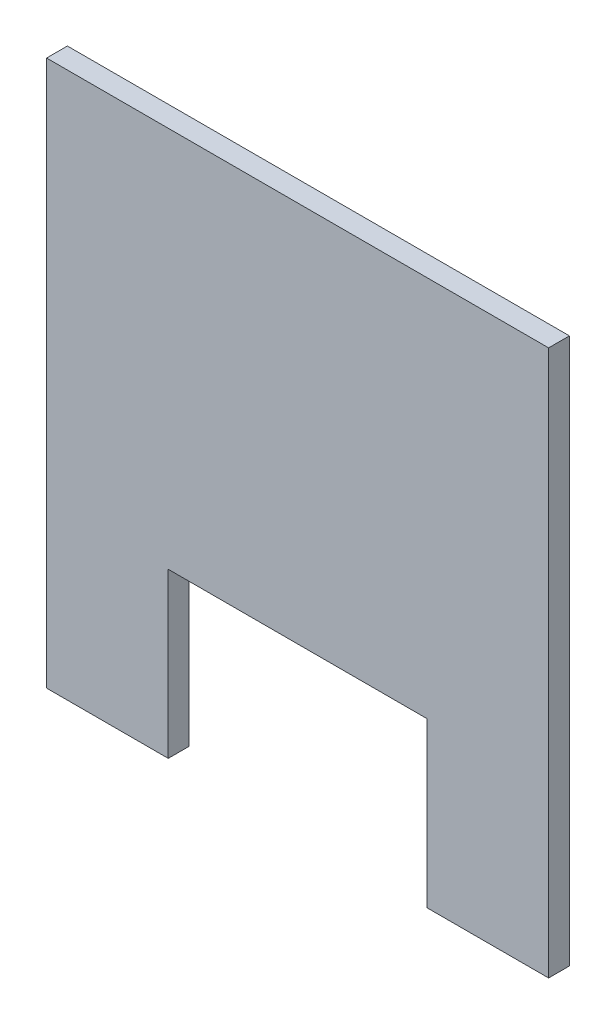
ISO-10303-21;
HEADER;
FILE_DESCRIPTION(('STEP AP214'),'2;1');
FILE_NAME('part.step','',(''),(''),'','','');
FILE_SCHEMA(('AUTOMOTIVE_DESIGN { 1 0 10303 214 1 1 1 1 }'));
ENDSEC;
DATA;
#1=APPLICATION_CONTEXT('core data for automotive mechanical design processes');
#2=APPLICATION_PROTOCOL_DEFINITION('international standard','automotive_design',2000,#1);
#3=PRODUCT_CONTEXT('',#1,'mechanical');
#4=PRODUCT('Part','Part','',(#3));
#5=PRODUCT_RELATED_PRODUCT_CATEGORY('part','',(#4));
#6=PRODUCT_DEFINITION_FORMATION('','',#4);
#7=PRODUCT_DEFINITION_CONTEXT('part definition',#1,'design');
#8=PRODUCT_DEFINITION('design','',#6,#7);
#9=PRODUCT_DEFINITION_SHAPE('','',#8);
#10=(LENGTH_UNIT() NAMED_UNIT(*) SI_UNIT(.MILLI.,.METRE.));
#11=(NAMED_UNIT(*) PLANE_ANGLE_UNIT() SI_UNIT($,.RADIAN.));
#12=(NAMED_UNIT(*) SI_UNIT($,.STERADIAN.) SOLID_ANGLE_UNIT());
#13=UNCERTAINTY_MEASURE_WITH_UNIT(LENGTH_MEASURE(1.E-05),#10,'distance_accuracy_value','');
#14=(GEOMETRIC_REPRESENTATION_CONTEXT(3) GLOBAL_UNCERTAINTY_ASSIGNED_CONTEXT((#13)) GLOBAL_UNIT_ASSIGNED_CONTEXT((#10,
#11,#12)) REPRESENTATION_CONTEXT('',''));
#15=CARTESIAN_POINT('',(0.,0.,0.));
#16=DIRECTION('',(0.,0.,1.));
#17=DIRECTION('',(1.,0.,0.));
#18=AXIS2_PLACEMENT_3D('',#15,#16,#17);
#19=CARTESIAN_POINT('',(0.,0.,-203.2));
#20=DIRECTION('',(0.,0.,-1.));
#21=DIRECTION('',(-1.,0.,0.));
#22=AXIS2_PLACEMENT_3D('',#19,#20,#21);
#23=PLANE('',#22);
#24=DIRECTION('',(1.,0.,0.));
#25=VECTOR('',#24,1.);
#26=CARTESIAN_POINT('',(0.,-325.863960413632,-203.2));
#27=LINE('',#26,#25);
#28=CARTESIAN_POINT('',(-157.970221804219,-325.863960413632,-203.2));
#29=VERTEX_POINT('',#28);
#30=CARTESIAN_POINT('',(157.970221804219,-325.863960413632,-203.2));
#31=VERTEX_POINT('',#30);
#32=EDGE_CURVE('E112',#29,#31,#27,.T.);
#33=ORIENTED_EDGE('',*,*,#32,.T.);
#34=DIRECTION('',(0.,1.,0.));
#35=VECTOR('',#34,1.);
#36=CARTESIAN_POINT('',(157.970221804219,-325.863960413632,-203.2));
#37=LINE('',#36,#35);
#38=CARTESIAN_POINT('',(157.970221804219,-525.863960413632,-203.2));
#39=VERTEX_POINT('',#38);
#40=EDGE_CURVE('E110',#39,#31,#37,.T.);
#41=ORIENTED_EDGE('',*,*,#40,.F.);
#42=DIRECTION('',(1.,0.,0.));
#43=VECTOR('',#42,1.);
#44=CARTESIAN_POINT('',(-306.531097362103,-525.863960413632,-203.2));
#45=LINE('',#44,#43);
#46=CARTESIAN_POINT('',(306.531097362103,-525.863960413632,-203.2));
#47=VERTEX_POINT('',#46);
#48=EDGE_CURVE('E37',#39,#47,#45,.T.);
#49=ORIENTED_EDGE('',*,*,#48,.T.);
#50=DIRECTION('',(0.,1.,0.));
#51=VECTOR('',#50,1.);
#52=CARTESIAN_POINT('',(306.531097362103,-525.863960413632,-203.2));
#53=LINE('',#52,#51);
#54=CARTESIAN_POINT('',(306.531097362103,140.529031303583,-203.2));
#55=VERTEX_POINT('',#54);
#56=EDGE_CURVE('E144',#47,#55,#53,.T.);
#57=ORIENTED_EDGE('',*,*,#56,.T.);
#58=DIRECTION('',(-1.,0.,0.));
#59=VECTOR('',#58,1.);
#60=CARTESIAN_POINT('',(-306.531097362103,140.529031303583,-203.2));
#61=LINE('',#60,#59);
#62=CARTESIAN_POINT('',(-306.531097362103,140.529031303583,-203.2));
#63=VERTEX_POINT('',#62);
#64=EDGE_CURVE('E142',#55,#63,#61,.T.);
#65=ORIENTED_EDGE('',*,*,#64,.T.);
#66=DIRECTION('',(0.,-1.,0.));
#67=VECTOR('',#66,1.);
#68=CARTESIAN_POINT('',(-306.531097362103,-525.863960413632,-203.2));
#69=LINE('',#68,#67);
#70=CARTESIAN_POINT('',(-306.531097362103,-525.863960413632,-203.2));
#71=VERTEX_POINT('',#70);
#72=EDGE_CURVE('E139',#63,#71,#69,.T.);
#73=ORIENTED_EDGE('',*,*,#72,.T.);
#74=CARTESIAN_POINT('',(-157.970221804219,-525.863960413632,-203.2));
#75=VERTEX_POINT('',#74);
#76=EDGE_CURVE('E108',#71,#75,#45,.T.);
#77=ORIENTED_EDGE('',*,*,#76,.T.);
#78=DIRECTION('',(0.,-1.,0.));
#79=VECTOR('',#78,1.);
#80=CARTESIAN_POINT('',(-157.970221804219,-325.863960413632,-203.2));
#81=LINE('',#80,#79);
#82=EDGE_CURVE('E114',#29,#75,#81,.T.);
#83=ORIENTED_EDGE('',*,*,#82,.F.);
#84=EDGE_LOOP('',(#33,#41,#49,#57,#65,#73,#77,#83));
#85=FACE_BOUND('',#84,.T.);
#86=ADVANCED_FACE('F33',(#85),#23,.F.);
#87=CARTESIAN_POINT('',(0.,0.,-228.6));
#88=DIRECTION('',(0.,0.,-1.));
#89=DIRECTION('',(-1.,0.,0.));
#90=AXIS2_PLACEMENT_3D('',#87,#88,#89);
#91=PLANE('',#90);
#92=DIRECTION('',(0.,-1.,0.));
#93=VECTOR('',#92,1.);
#94=CARTESIAN_POINT('',(157.970221804219,0.,-228.6));
#95=LINE('',#94,#93);
#96=CARTESIAN_POINT('',(157.970221804219,-325.863960413632,-228.6));
#97=VERTEX_POINT('',#96);
#98=CARTESIAN_POINT('',(157.970221804219,-525.863960413632,-228.6));
#99=VERTEX_POINT('',#98);
#100=EDGE_CURVE('E118',#97,#99,#95,.T.);
#101=ORIENTED_EDGE('',*,*,#100,.F.);
#102=DIRECTION('',(-1.,0.,0.));
#103=VECTOR('',#102,1.);
#104=CARTESIAN_POINT('',(0.,-325.863960413632,-228.6));
#105=LINE('',#104,#103);
#106=CARTESIAN_POINT('',(-157.970221804219,-325.863960413632,-228.6));
#107=VERTEX_POINT('',#106);
#108=EDGE_CURVE('E50',#97,#107,#105,.T.);
#109=ORIENTED_EDGE('',*,*,#108,.T.);
#110=DIRECTION('',(0.,1.,0.));
#111=VECTOR('',#110,1.);
#112=CARTESIAN_POINT('',(-157.970221804219,0.,-228.6));
#113=LINE('',#112,#111);
#114=CARTESIAN_POINT('',(-157.970221804219,-525.863960413632,-228.6));
#115=VERTEX_POINT('',#114);
#116=EDGE_CURVE('E163',#115,#107,#113,.T.);
#117=ORIENTED_EDGE('',*,*,#116,.F.);
#118=DIRECTION('',(1.,0.,0.));
#119=VECTOR('',#118,1.);
#120=CARTESIAN_POINT('',(-306.531097362103,-525.863960413632,-228.6));
#121=LINE('',#120,#119);
#122=CARTESIAN_POINT('',(-306.531097362103,-525.863960413632,-228.6));
#123=VERTEX_POINT('',#122);
#124=EDGE_CURVE('E150',#123,#115,#121,.T.);
#125=ORIENTED_EDGE('',*,*,#124,.F.);
#126=DIRECTION('',(0.,-1.,0.));
#127=VECTOR('',#126,1.);
#128=CARTESIAN_POINT('',(-306.531097362103,-525.863960413632,-228.6));
#129=LINE('',#128,#127);
#130=CARTESIAN_POINT('',(-306.531097362103,140.529031303583,-228.6));
#131=VERTEX_POINT('',#130);
#132=EDGE_CURVE('E157',#131,#123,#129,.T.);
#133=ORIENTED_EDGE('',*,*,#132,.F.);
#134=DIRECTION('',(-1.,0.,0.));
#135=VECTOR('',#134,1.);
#136=CARTESIAN_POINT('',(-306.531097362103,140.529031303583,-228.6));
#137=LINE('',#136,#135);
#138=CARTESIAN_POINT('',(306.531097362103,140.529031303583,-228.6));
#139=VERTEX_POINT('',#138);
#140=EDGE_CURVE('E130',#139,#131,#137,.T.);
#141=ORIENTED_EDGE('',*,*,#140,.F.);
#142=DIRECTION('',(0.,1.,0.));
#143=VECTOR('',#142,1.);
#144=CARTESIAN_POINT('',(306.531097362103,-525.863960413632,-228.6));
#145=LINE('',#144,#143);
#146=CARTESIAN_POINT('',(306.531097362103,-525.863960413632,-228.6));
#147=VERTEX_POINT('',#146);
#148=EDGE_CURVE('E155',#147,#139,#145,.T.);
#149=ORIENTED_EDGE('',*,*,#148,.F.);
#150=EDGE_CURVE('E154',#99,#147,#121,.T.);
#151=ORIENTED_EDGE('',*,*,#150,.F.);
#152=EDGE_LOOP('',(#101,#109,#117,#125,#133,#141,#149,#151));
#153=FACE_BOUND('',#152,.T.);
#154=ADVANCED_FACE('F165',(#153),#91,.T.);
#155=CARTESIAN_POINT('',(0.,-325.863960413632,0.));
#156=DIRECTION('',(0.,-1.,0.));
#157=DIRECTION('',(0.,0.,-1.));
#158=AXIS2_PLACEMENT_3D('',#155,#156,#157);
#159=PLANE('',#158);
#160=ORIENTED_EDGE('',*,*,#32,.F.);
#161=DIRECTION('',(0.,0.,-1.));
#162=VECTOR('',#161,1.);
#163=CARTESIAN_POINT('',(-157.970221804219,-325.863960413632,-186.783065914861));
#164=LINE('',#163,#162);
#165=EDGE_CURVE('E119',#29,#107,#164,.T.);
#166=ORIENTED_EDGE('',*,*,#165,.T.);
#167=ORIENTED_EDGE('',*,*,#108,.F.);
#168=DIRECTION('',(0.,0.,1.));
#169=VECTOR('',#168,1.);
#170=CARTESIAN_POINT('',(157.970221804219,-325.863960413632,-316.273188267458));
#171=LINE('',#170,#169);
#172=EDGE_CURVE('E121',#97,#31,#171,.T.);
#173=ORIENTED_EDGE('',*,*,#172,.T.);
#174=EDGE_LOOP('',(#160,#166,#167,#173));
#175=FACE_BOUND('',#174,.T.);
#176=ADVANCED_FACE('F177',(#175),#159,.T.);
#177=CARTESIAN_POINT('',(-157.970221804219,-325.863960413632,-186.783065914861));
#178=DIRECTION('',(-1.,0.,0.));
#179=DIRECTION('',(0.,0.,1.));
#180=AXIS2_PLACEMENT_3D('',#177,#178,#179);
#181=PLANE('',#180);
#182=ORIENTED_EDGE('',*,*,#165,.F.);
#183=ORIENTED_EDGE('',*,*,#82,.T.);
#184=DIRECTION('',(0.,0.,-1.));
#185=VECTOR('',#184,1.);
#186=CARTESIAN_POINT('',(-157.970221804219,-525.863960413632,-186.783065914861));
#187=LINE('',#186,#185);
#188=EDGE_CURVE('E11',#75,#115,#187,.T.);
#189=ORIENTED_EDGE('',*,*,#188,.T.);
#190=ORIENTED_EDGE('',*,*,#116,.T.);
#191=EDGE_LOOP('',(#182,#183,#189,#190));
#192=FACE_BOUND('',#191,.T.);
#193=ADVANCED_FACE('F176',(#192),#181,.F.);
#194=CARTESIAN_POINT('',(-306.531097362103,-525.863960413632,-228.6));
#195=DIRECTION('',(0.,-1.,0.));
#196=DIRECTION('',(0.,0.,-1.));
#197=AXIS2_PLACEMENT_3D('',#194,#195,#196);
#198=PLANE('',#197);
#199=ORIENTED_EDGE('',*,*,#76,.F.);
#200=DIRECTION('',(0.,0.,1.));
#201=VECTOR('',#200,1.);
#202=CARTESIAN_POINT('',(-306.531097362103,-525.863960413632,-228.6));
#203=LINE('',#202,#201);
#204=EDGE_CURVE('E127',#123,#71,#203,.T.);
#205=ORIENTED_EDGE('',*,*,#204,.F.);
#206=ORIENTED_EDGE('',*,*,#124,.T.);
#207=ORIENTED_EDGE('',*,*,#188,.F.);
#208=EDGE_LOOP('',(#199,#205,#206,#207));
#209=FACE_BOUND('',#208,.T.);
#210=ADVANCED_FACE('F148',(#209),#198,.T.);
#211=CARTESIAN_POINT('',(-306.531097362103,-525.863960413632,-228.6));
#212=DIRECTION('',(-1.,0.,0.));
#213=DIRECTION('',(0.,0.,1.));
#214=AXIS2_PLACEMENT_3D('',#211,#212,#213);
#215=PLANE('',#214);
#216=ORIENTED_EDGE('',*,*,#72,.F.);
#217=DIRECTION('',(0.,0.,1.));
#218=VECTOR('',#217,1.);
#219=CARTESIAN_POINT('',(-306.531097362103,140.529031303583,-228.6));
#220=LINE('',#219,#218);
#221=EDGE_CURVE('E135',#131,#63,#220,.T.);
#222=ORIENTED_EDGE('',*,*,#221,.F.);
#223=ORIENTED_EDGE('',*,*,#132,.T.);
#224=ORIENTED_EDGE('',*,*,#204,.T.);
#225=EDGE_LOOP('',(#216,#222,#223,#224));
#226=FACE_BOUND('',#225,.T.);
#227=ADVANCED_FACE('F174',(#226),#215,.T.);
#228=CARTESIAN_POINT('',(-306.531097362103,140.529031303583,-228.6));
#229=DIRECTION('',(0.,1.,0.));
#230=DIRECTION('',(0.,0.,1.));
#231=AXIS2_PLACEMENT_3D('',#228,#229,#230);
#232=PLANE('',#231);
#233=ORIENTED_EDGE('',*,*,#64,.F.);
#234=DIRECTION('',(0.,0.,1.));
#235=VECTOR('',#234,1.);
#236=CARTESIAN_POINT('',(306.531097362103,140.529031303583,-228.6));
#237=LINE('',#236,#235);
#238=EDGE_CURVE('E132',#139,#55,#237,.T.);
#239=ORIENTED_EDGE('',*,*,#238,.F.);
#240=ORIENTED_EDGE('',*,*,#140,.T.);
#241=ORIENTED_EDGE('',*,*,#221,.T.);
#242=EDGE_LOOP('',(#233,#239,#240,#241));
#243=FACE_BOUND('',#242,.T.);
#244=ADVANCED_FACE('F172',(#243),#232,.T.);
#245=CARTESIAN_POINT('',(306.531097362103,-525.863960413632,-228.6));
#246=DIRECTION('',(1.,0.,0.));
#247=DIRECTION('',(0.,0.,-1.));
#248=AXIS2_PLACEMENT_3D('',#245,#246,#247);
#249=PLANE('',#248);
#250=ORIENTED_EDGE('',*,*,#56,.F.);
#251=DIRECTION('',(0.,0.,1.));
#252=VECTOR('',#251,1.);
#253=CARTESIAN_POINT('',(306.531097362103,-525.863960413632,-228.6));
#254=LINE('',#253,#252);
#255=EDGE_CURVE('E105',#147,#47,#254,.T.);
#256=ORIENTED_EDGE('',*,*,#255,.F.);
#257=ORIENTED_EDGE('',*,*,#148,.T.);
#258=ORIENTED_EDGE('',*,*,#238,.T.);
#259=EDGE_LOOP('',(#250,#256,#257,#258));
#260=FACE_BOUND('',#259,.T.);
#261=ADVANCED_FACE('F169',(#260),#249,.T.);
#262=CARTESIAN_POINT('',(157.970221804219,-325.863960413632,-316.273188267458));
#263=DIRECTION('',(1.,0.,0.));
#264=DIRECTION('',(0.,0.,-1.));
#265=AXIS2_PLACEMENT_3D('',#262,#263,#264);
#266=PLANE('',#265);
#267=DIRECTION('',(0.,0.,1.));
#268=VECTOR('',#267,1.);
#269=CARTESIAN_POINT('',(157.970221804219,-525.863960413632,-316.273188267458));
#270=LINE('',#269,#268);
#271=EDGE_CURVE('E42',#99,#39,#270,.T.);
#272=ORIENTED_EDGE('',*,*,#271,.T.);
#273=ORIENTED_EDGE('',*,*,#40,.T.);
#274=ORIENTED_EDGE('',*,*,#172,.F.);
#275=ORIENTED_EDGE('',*,*,#100,.T.);
#276=EDGE_LOOP('',(#272,#273,#274,#275));
#277=FACE_BOUND('',#276,.T.);
#278=ADVANCED_FACE('F116',(#277),#266,.F.);
#279=ORIENTED_EDGE('',*,*,#48,.F.);
#280=ORIENTED_EDGE('',*,*,#271,.F.);
#281=ORIENTED_EDGE('',*,*,#150,.T.);
#282=ORIENTED_EDGE('',*,*,#255,.T.);
#283=EDGE_LOOP('',(#279,#280,#281,#282));
#284=FACE_BOUND('',#283,.T.);
#285=ADVANCED_FACE('F35',(#284),#198,.T.);
#286=CLOSED_SHELL('',(#86,#154,#176,#193,#210,#227,#244,#261,#278,#285));
#287=MANIFOLD_SOLID_BREP('B2',#286);
#288=ADVANCED_BREP_SHAPE_REPRESENTATION('',(#18,#287),#14);
#289=SHAPE_DEFINITION_REPRESENTATION(#9,#288);
ENDSEC;
END-ISO-10303-21;
